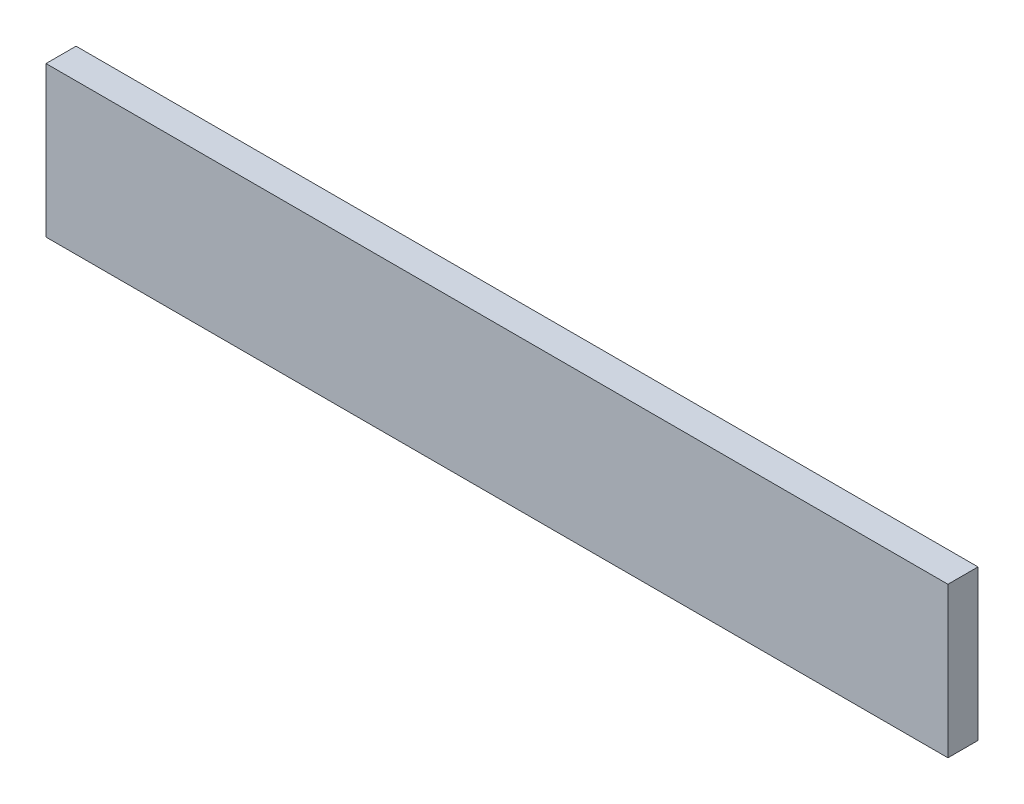
ISO-10303-21;
HEADER;
FILE_DESCRIPTION(('STEP AP214'),'2;1');
FILE_NAME('part.step','',(''),(''),'','','');
FILE_SCHEMA(('AUTOMOTIVE_DESIGN { 1 0 10303 214 1 1 1 1 }'));
ENDSEC;
DATA;
#1=APPLICATION_CONTEXT('core data for automotive mechanical design processes');
#2=APPLICATION_PROTOCOL_DEFINITION('international standard','automotive_design',2000,#1);
#3=PRODUCT_CONTEXT('',#1,'mechanical');
#4=PRODUCT('Part','Part','',(#3));
#5=PRODUCT_RELATED_PRODUCT_CATEGORY('part','',(#4));
#6=PRODUCT_DEFINITION_FORMATION('','',#4);
#7=PRODUCT_DEFINITION_CONTEXT('part definition',#1,'design');
#8=PRODUCT_DEFINITION('design','',#6,#7);
#9=PRODUCT_DEFINITION_SHAPE('','',#8);
#10=(LENGTH_UNIT() NAMED_UNIT(*) SI_UNIT(.MILLI.,.METRE.));
#11=(NAMED_UNIT(*) PLANE_ANGLE_UNIT() SI_UNIT($,.RADIAN.));
#12=(NAMED_UNIT(*) SI_UNIT($,.STERADIAN.) SOLID_ANGLE_UNIT());
#13=UNCERTAINTY_MEASURE_WITH_UNIT(LENGTH_MEASURE(1.E-05),#10,'distance_accuracy_value','');
#14=(GEOMETRIC_REPRESENTATION_CONTEXT(3) GLOBAL_UNCERTAINTY_ASSIGNED_CONTEXT((#13)) GLOBAL_UNIT_ASSIGNED_CONTEXT((#10,
#11,#12)) REPRESENTATION_CONTEXT('',''));
#15=CARTESIAN_POINT('',(0.,0.,0.));
#16=DIRECTION('',(0.,0.,1.));
#17=DIRECTION('',(1.,0.,0.));
#18=AXIS2_PLACEMENT_3D('',#15,#16,#17);
#19=CARTESIAN_POINT('',(600.,0.,0.));
#20=DIRECTION('',(1.,0.,0.));
#21=DIRECTION('',(0.,1.,0.));
#22=AXIS2_PLACEMENT_3D('',#19,#20,#21);
#23=PLANE('',#22);
#24=DIRECTION('',(0.,0.,1.));
#25=VECTOR('',#24,1.);
#26=CARTESIAN_POINT('',(600.,-100.,0.));
#27=LINE('',#26,#25);
#28=CARTESIAN_POINT('',(600.,-100.,0.));
#29=VERTEX_POINT('',#28);
#30=CARTESIAN_POINT('',(600.,-100.,20.));
#31=VERTEX_POINT('',#30);
#32=EDGE_CURVE('E11',#29,#31,#27,.T.);
#33=ORIENTED_EDGE('',*,*,#32,.F.);
#34=DIRECTION('',(0.,1.,0.));
#35=VECTOR('',#34,1.);
#36=CARTESIAN_POINT('',(600.,0.,0.));
#37=LINE('',#36,#35);
#38=CARTESIAN_POINT('',(600.,0.,0.));
#39=VERTEX_POINT('',#38);
#40=EDGE_CURVE('E94',#29,#39,#37,.T.);
#41=ORIENTED_EDGE('',*,*,#40,.T.);
#42=DIRECTION('',(0.,0.,1.));
#43=VECTOR('',#42,1.);
#44=CARTESIAN_POINT('',(600.,0.,0.));
#45=LINE('',#44,#43);
#46=CARTESIAN_POINT('',(600.,0.,20.));
#47=VERTEX_POINT('',#46);
#48=EDGE_CURVE('E49',#39,#47,#45,.T.);
#49=ORIENTED_EDGE('',*,*,#48,.T.);
#50=DIRECTION('',(0.,1.,0.));
#51=VECTOR('',#50,1.);
#52=CARTESIAN_POINT('',(600.,-100.,20.));
#53=LINE('',#52,#51);
#54=EDGE_CURVE('E104',#31,#47,#53,.T.);
#55=ORIENTED_EDGE('',*,*,#54,.F.);
#56=EDGE_LOOP('',(#33,#41,#49,#55));
#57=FACE_BOUND('',#56,.T.);
#58=ADVANCED_FACE('F39',(#57),#23,.T.);
#59=CARTESIAN_POINT('',(0.,0.,0.));
#60=DIRECTION('',(0.,1.,0.));
#61=DIRECTION('',(-1.,0.,0.));
#62=AXIS2_PLACEMENT_3D('',#59,#60,#61);
#63=PLANE('',#62);
#64=ORIENTED_EDGE('',*,*,#48,.F.);
#65=DIRECTION('',(-1.,0.,0.));
#66=VECTOR('',#65,1.);
#67=CARTESIAN_POINT('',(0.,0.,0.));
#68=LINE('',#67,#66);
#69=CARTESIAN_POINT('',(0.,0.,0.));
#70=VERTEX_POINT('',#69);
#71=EDGE_CURVE('E89',#39,#70,#68,.T.);
#72=ORIENTED_EDGE('',*,*,#71,.T.);
#73=DIRECTION('',(0.,0.,1.));
#74=VECTOR('',#73,1.);
#75=CARTESIAN_POINT('',(0.,0.,0.));
#76=LINE('',#75,#74);
#77=CARTESIAN_POINT('',(0.,0.,20.));
#78=VERTEX_POINT('',#77);
#79=EDGE_CURVE('E57',#70,#78,#76,.T.);
#80=ORIENTED_EDGE('',*,*,#79,.T.);
#81=DIRECTION('',(1.,0.,0.));
#82=VECTOR('',#81,1.);
#83=CARTESIAN_POINT('',(0.,0.,20.));
#84=LINE('',#83,#82);
#85=EDGE_CURVE('E108',#47,#78,#84,.F.);
#86=ORIENTED_EDGE('',*,*,#85,.F.);
#87=EDGE_LOOP('',(#64,#72,#80,#86));
#88=FACE_BOUND('',#87,.T.);
#89=ADVANCED_FACE('F93',(#88),#63,.T.);
#90=CARTESIAN_POINT('',(0.,0.,0.));
#91=DIRECTION('',(-1.,0.,0.));
#92=DIRECTION('',(0.,-1.,0.));
#93=AXIS2_PLACEMENT_3D('',#90,#91,#92);
#94=PLANE('',#93);
#95=ORIENTED_EDGE('',*,*,#79,.F.);
#96=DIRECTION('',(0.,-1.,0.));
#97=VECTOR('',#96,1.);
#98=CARTESIAN_POINT('',(0.,0.,0.));
#99=LINE('',#98,#97);
#100=CARTESIAN_POINT('',(0.,-100.,0.));
#101=VERTEX_POINT('',#100);
#102=EDGE_CURVE('E79',#70,#101,#99,.T.);
#103=ORIENTED_EDGE('',*,*,#102,.T.);
#104=DIRECTION('',(0.,0.,1.));
#105=VECTOR('',#104,1.);
#106=CARTESIAN_POINT('',(0.,-100.,0.));
#107=LINE('',#106,#105);
#108=CARTESIAN_POINT('',(0.,-100.,20.));
#109=VERTEX_POINT('',#108);
#110=EDGE_CURVE('E43',#101,#109,#107,.T.);
#111=ORIENTED_EDGE('',*,*,#110,.T.);
#112=DIRECTION('',(0.,1.,0.));
#113=VECTOR('',#112,1.);
#114=CARTESIAN_POINT('',(0.,-100.,20.));
#115=LINE('',#114,#113);
#116=EDGE_CURVE('E81',#78,#109,#115,.F.);
#117=ORIENTED_EDGE('',*,*,#116,.F.);
#118=EDGE_LOOP('',(#95,#103,#111,#117));
#119=FACE_BOUND('',#118,.T.);
#120=ADVANCED_FACE('F78',(#119),#94,.T.);
#121=CARTESIAN_POINT('',(0.,-100.,0.));
#122=DIRECTION('',(0.,-1.,0.));
#123=DIRECTION('',(1.,0.,0.));
#124=AXIS2_PLACEMENT_3D('',#121,#122,#123);
#125=PLANE('',#124);
#126=DIRECTION('',(1.,0.,0.));
#127=VECTOR('',#126,1.);
#128=CARTESIAN_POINT('',(0.,-100.,0.));
#129=LINE('',#128,#127);
#130=EDGE_CURVE('E91',#101,#29,#129,.T.);
#131=ORIENTED_EDGE('',*,*,#130,.T.);
#132=ORIENTED_EDGE('',*,*,#32,.T.);
#133=DIRECTION('',(1.,0.,0.));
#134=VECTOR('',#133,1.);
#135=CARTESIAN_POINT('',(0.,-100.,20.));
#136=LINE('',#135,#134);
#137=EDGE_CURVE('E96',#109,#31,#136,.T.);
#138=ORIENTED_EDGE('',*,*,#137,.F.);
#139=ORIENTED_EDGE('',*,*,#110,.F.);
#140=EDGE_LOOP('',(#131,#132,#138,#139));
#141=FACE_BOUND('',#140,.T.);
#142=ADVANCED_FACE('F41',(#141),#125,.T.);
#143=CARTESIAN_POINT('',(0.,-100.,20.));
#144=DIRECTION('',(0.,0.,1.));
#145=DIRECTION('',(1.,0.,0.));
#146=AXIS2_PLACEMENT_3D('',#143,#144,#145);
#147=PLANE('',#146);
#148=ORIENTED_EDGE('',*,*,#116,.T.);
#149=ORIENTED_EDGE('',*,*,#137,.T.);
#150=ORIENTED_EDGE('',*,*,#54,.T.);
#151=ORIENTED_EDGE('',*,*,#85,.T.);
#152=EDGE_LOOP('',(#148,#149,#150,#151));
#153=FACE_BOUND('',#152,.T.);
#154=ADVANCED_FACE('F107',(#153),#147,.T.);
#155=CARTESIAN_POINT('',(0.,-100.,0.));
#156=DIRECTION('',(0.,0.,1.));
#157=DIRECTION('',(1.,0.,0.));
#158=AXIS2_PLACEMENT_3D('',#155,#156,#157);
#159=PLANE('',#158);
#160=ORIENTED_EDGE('',*,*,#102,.F.);
#161=ORIENTED_EDGE('',*,*,#71,.F.);
#162=ORIENTED_EDGE('',*,*,#40,.F.);
#163=ORIENTED_EDGE('',*,*,#130,.F.);
#164=EDGE_LOOP('',(#160,#161,#162,#163));
#165=FACE_BOUND('',#164,.T.);
#166=ADVANCED_FACE('F87',(#165),#159,.F.);
#167=CLOSED_SHELL('',(#58,#89,#120,#142,#154,#166));
#168=MANIFOLD_SOLID_BREP('B2',#167);
#169=ADVANCED_BREP_SHAPE_REPRESENTATION('',(#18,#168),#14);
#170=SHAPE_DEFINITION_REPRESENTATION(#9,#169);
ENDSEC;
END-ISO-10303-21;
